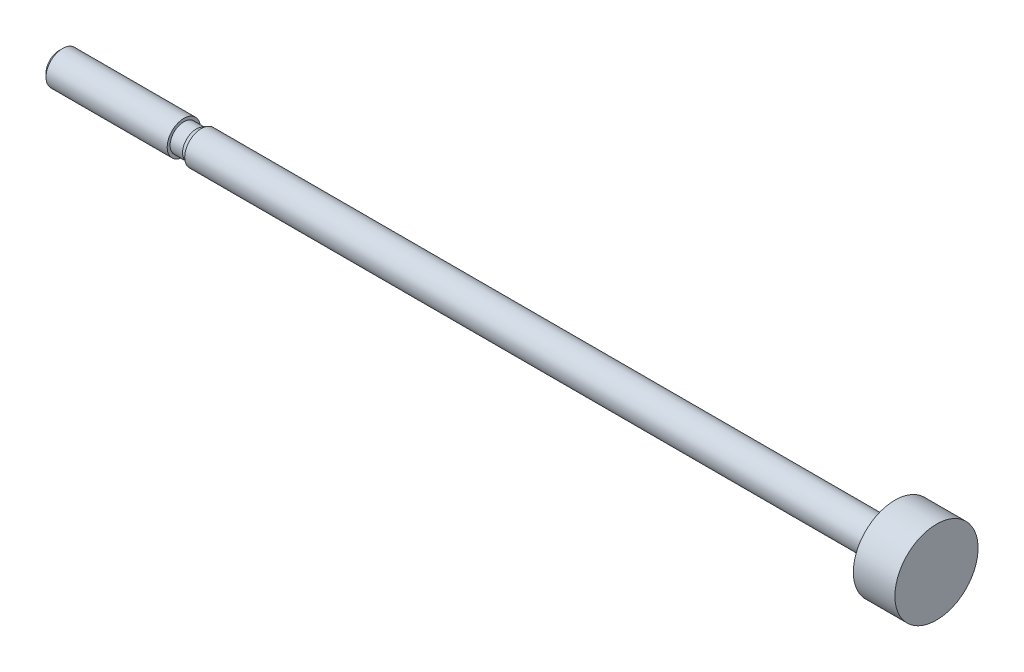
ISO-10303-21;
HEADER;
FILE_DESCRIPTION(('STEP AP214'),'2;1');
FILE_NAME('part.step','',(''),(''),'','','');
FILE_SCHEMA(('AUTOMOTIVE_DESIGN { 1 0 10303 214 1 1 1 1 }'));
ENDSEC;
DATA;
#1=APPLICATION_CONTEXT('core data for automotive mechanical design processes');
#2=APPLICATION_PROTOCOL_DEFINITION('international standard','automotive_design',2000,#1);
#3=PRODUCT_CONTEXT('',#1,'mechanical');
#4=PRODUCT('Part','Part','',(#3));
#5=PRODUCT_RELATED_PRODUCT_CATEGORY('part','',(#4));
#6=PRODUCT_DEFINITION_FORMATION('','',#4);
#7=PRODUCT_DEFINITION_CONTEXT('part definition',#1,'design');
#8=PRODUCT_DEFINITION('design','',#6,#7);
#9=PRODUCT_DEFINITION_SHAPE('','',#8);
#10=(LENGTH_UNIT() NAMED_UNIT(*) SI_UNIT(.MILLI.,.METRE.));
#11=(NAMED_UNIT(*) PLANE_ANGLE_UNIT() SI_UNIT($,.RADIAN.));
#12=(NAMED_UNIT(*) SI_UNIT($,.STERADIAN.) SOLID_ANGLE_UNIT());
#13=UNCERTAINTY_MEASURE_WITH_UNIT(LENGTH_MEASURE(1.E-05),#10,'distance_accuracy_value','');
#14=(GEOMETRIC_REPRESENTATION_CONTEXT(3) GLOBAL_UNCERTAINTY_ASSIGNED_CONTEXT((#13)) GLOBAL_UNIT_ASSIGNED_CONTEXT((#10,
#11,#12)) REPRESENTATION_CONTEXT('',''));
#15=CARTESIAN_POINT('',(0.,0.,0.));
#16=DIRECTION('',(0.,0.,1.));
#17=DIRECTION('',(1.,0.,0.));
#18=AXIS2_PLACEMENT_3D('',#15,#16,#17);
#19=CARTESIAN_POINT('',(0.,0.,0.));
#20=DIRECTION('',(1.,0.,0.));
#21=DIRECTION('',(0.,0.,-1.));
#22=AXIS2_PLACEMENT_3D('',#19,#20,#21);
#23=PLANE('',#22);
#24=CARTESIAN_POINT('',(0.,0.,0.));
#25=DIRECTION('',(-1.,0.,0.));
#26=DIRECTION('',(0.,0.,1.));
#27=AXIS2_PLACEMENT_3D('',#24,#25,#26);
#28=CIRCLE('',#27,1.5705);
#29=CARTESIAN_POINT('',(0.,0.,1.5705));
#30=VERTEX_POINT('',#29);
#31=EDGE_CURVE('E10',#30,#30,#28,.T.);
#32=ORIENTED_EDGE('',*,*,#31,.T.);
#33=EDGE_LOOP('',(#32));
#34=FACE_BOUND('',#33,.T.);
#35=ADVANCED_FACE('F34',(#34),#23,.F.);
#36=CARTESIAN_POINT('',(0.429499999999999,0.,0.));
#37=DIRECTION('',(1.,0.,0.));
#38=DIRECTION('',(0.,0.,-1.));
#39=AXIS2_PLACEMENT_3D('',#36,#37,#38);
#40=CONICAL_SURFACE('',#39,2.,0.785398163397449);
#41=ORIENTED_EDGE('',*,*,#31,.F.);
#42=EDGE_LOOP('',(#41));
#43=FACE_BOUND('',#42,.T.);
#44=CARTESIAN_POINT('',(0.429499999999999,0.,0.));
#45=DIRECTION('',(-1.,0.,0.));
#46=DIRECTION('',(0.,0.,1.));
#47=AXIS2_PLACEMENT_3D('',#44,#45,#46);
#48=CIRCLE('',#47,2.);
#49=CARTESIAN_POINT('',(0.429499999999999,0.,2.));
#50=VERTEX_POINT('',#49);
#51=EDGE_CURVE('E40',#50,#50,#48,.T.);
#52=ORIENTED_EDGE('',*,*,#51,.T.);
#53=EDGE_LOOP('',(#52));
#54=FACE_BOUND('',#53,.T.);
#55=ADVANCED_FACE('F81',(#43,#54),#40,.T.);
#56=CARTESIAN_POINT('',(105.5,0.,0.));
#57=DIRECTION('',(-1.,0.,0.));
#58=DIRECTION('',(0.,0.,1.));
#59=AXIS2_PLACEMENT_3D('',#56,#57,#58);
#60=CYLINDRICAL_SURFACE('',#59,2.);
#61=ORIENTED_EDGE('',*,*,#51,.F.);
#62=EDGE_LOOP('',(#61));
#63=FACE_BOUND('',#62,.T.);
#64=CARTESIAN_POINT('',(15.,0.,0.));
#65=DIRECTION('',(-1.,0.,0.));
#66=DIRECTION('',(0.,0.,1.));
#67=AXIS2_PLACEMENT_3D('',#64,#65,#66);
#68=CIRCLE('',#67,2.);
#69=CARTESIAN_POINT('',(15.,0.,2.));
#70=VERTEX_POINT('',#69);
#71=EDGE_CURVE('E44',#70,#70,#68,.T.);
#72=ORIENTED_EDGE('',*,*,#71,.T.);
#73=EDGE_LOOP('',(#72));
#74=FACE_BOUND('',#73,.T.);
#75=ADVANCED_FACE('F85',(#63,#74),#60,.T.);
#76=CARTESIAN_POINT('',(15.,2.,0.));
#77=DIRECTION('',(-1.,0.,0.));
#78=DIRECTION('',(0.,0.,1.));
#79=AXIS2_PLACEMENT_3D('',#76,#77,#78);
#80=PLANE('',#79);
#81=ORIENTED_EDGE('',*,*,#71,.F.);
#82=EDGE_LOOP('',(#81));
#83=FACE_BOUND('',#82,.T.);
#84=CARTESIAN_POINT('',(15.,0.,0.));
#85=DIRECTION('',(-1.,0.,0.));
#86=DIRECTION('',(0.,0.,1.));
#87=AXIS2_PLACEMENT_3D('',#84,#85,#86);
#88=CIRCLE('',#87,1.65);
#89=CARTESIAN_POINT('',(15.,0.,1.65));
#90=VERTEX_POINT('',#89);
#91=EDGE_CURVE('E48',#90,#90,#88,.T.);
#92=ORIENTED_EDGE('',*,*,#91,.T.);
#93=EDGE_LOOP('',(#92));
#94=FACE_BOUND('',#93,.T.);
#95=ADVANCED_FACE('F90',(#83,#94),#80,.F.);
#96=CARTESIAN_POINT('',(105.5,0.,0.));
#97=DIRECTION('',(-1.,0.,0.));
#98=DIRECTION('',(0.,0.,1.));
#99=AXIS2_PLACEMENT_3D('',#96,#97,#98);
#100=CYLINDRICAL_SURFACE('',#99,1.65);
#101=ORIENTED_EDGE('',*,*,#91,.F.);
#102=EDGE_LOOP('',(#101));
#103=FACE_BOUND('',#102,.T.);
#104=CARTESIAN_POINT('',(16.5,0.,0.));
#105=DIRECTION('',(-1.,0.,0.));
#106=DIRECTION('',(0.,0.,1.));
#107=AXIS2_PLACEMENT_3D('',#104,#105,#106);
#108=CIRCLE('',#107,1.65);
#109=CARTESIAN_POINT('',(16.5,0.,1.65));
#110=VERTEX_POINT('',#109);
#111=EDGE_CURVE('E53',#110,#110,#108,.T.);
#112=ORIENTED_EDGE('',*,*,#111,.T.);
#113=EDGE_LOOP('',(#112));
#114=FACE_BOUND('',#113,.T.);
#115=ADVANCED_FACE('F96',(#103,#114),#100,.T.);
#116=CARTESIAN_POINT('',(17.106217782649,0.,0.));
#117=DIRECTION('',(1.,0.,0.));
#118=DIRECTION('',(0.,0.,-1.));
#119=AXIS2_PLACEMENT_3D('',#116,#117,#118);
#120=CONICAL_SURFACE('',#119,2.,0.52359877559838);
#121=ORIENTED_EDGE('',*,*,#111,.F.);
#122=EDGE_LOOP('',(#121));
#123=FACE_BOUND('',#122,.T.);
#124=CARTESIAN_POINT('',(17.106217782649,0.,0.));
#125=DIRECTION('',(-1.,0.,0.));
#126=DIRECTION('',(0.,0.,1.));
#127=AXIS2_PLACEMENT_3D('',#124,#125,#126);
#128=CIRCLE('',#127,2.);
#129=CARTESIAN_POINT('',(17.106217782649,0.,2.));
#130=VERTEX_POINT('',#129);
#131=EDGE_CURVE('E56',#130,#130,#128,.T.);
#132=ORIENTED_EDGE('',*,*,#131,.T.);
#133=EDGE_LOOP('',(#132));
#134=FACE_BOUND('',#133,.T.);
#135=ADVANCED_FACE('F100',(#123,#134),#120,.T.);
#136=CARTESIAN_POINT('',(105.5,0.,0.));
#137=DIRECTION('',(-1.,0.,0.));
#138=DIRECTION('',(0.,0.,1.));
#139=AXIS2_PLACEMENT_3D('',#136,#137,#138);
#140=CYLINDRICAL_SURFACE('',#139,2.);
#141=ORIENTED_EDGE('',*,*,#131,.F.);
#142=EDGE_LOOP('',(#141));
#143=FACE_BOUND('',#142,.T.);
#144=CARTESIAN_POINT('',(100.5,0.,0.));
#145=DIRECTION('',(-1.,0.,0.));
#146=DIRECTION('',(0.,0.,1.));
#147=AXIS2_PLACEMENT_3D('',#144,#145,#146);
#148=CIRCLE('',#147,2.);
#149=CARTESIAN_POINT('',(100.5,0.,2.));
#150=VERTEX_POINT('',#149);
#151=EDGE_CURVE('E59',#150,#150,#148,.T.);
#152=ORIENTED_EDGE('',*,*,#151,.T.);
#153=EDGE_LOOP('',(#152));
#154=FACE_BOUND('',#153,.T.);
#155=ADVANCED_FACE('F104',(#143,#154),#140,.T.);
#156=CARTESIAN_POINT('',(100.5,2.,0.));
#157=DIRECTION('',(1.,0.,0.));
#158=DIRECTION('',(0.,0.,-1.));
#159=AXIS2_PLACEMENT_3D('',#156,#157,#158);
#160=PLANE('',#159);
#161=ORIENTED_EDGE('',*,*,#151,.F.);
#162=EDGE_LOOP('',(#161));
#163=FACE_BOUND('',#162,.T.);
#164=CARTESIAN_POINT('',(100.5,0.,0.));
#165=DIRECTION('',(-1.,0.,0.));
#166=DIRECTION('',(0.,0.,1.));
#167=AXIS2_PLACEMENT_3D('',#164,#165,#166);
#168=CIRCLE('',#167,5.);
#169=CARTESIAN_POINT('',(100.5,0.,5.));
#170=VERTEX_POINT('',#169);
#171=EDGE_CURVE('E62',#170,#170,#168,.T.);
#172=ORIENTED_EDGE('',*,*,#171,.T.);
#173=EDGE_LOOP('',(#172));
#174=FACE_BOUND('',#173,.T.);
#175=ADVANCED_FACE('F77',(#163,#174),#160,.F.);
#176=CARTESIAN_POINT('',(105.5,0.,0.));
#177=DIRECTION('',(-1.,0.,0.));
#178=DIRECTION('',(0.,0.,1.));
#179=AXIS2_PLACEMENT_3D('',#176,#177,#178);
#180=CYLINDRICAL_SURFACE('',#179,5.);
#181=ORIENTED_EDGE('',*,*,#171,.F.);
#182=EDGE_LOOP('',(#181));
#183=FACE_BOUND('',#182,.T.);
#184=CARTESIAN_POINT('',(105.5,0.,0.));
#185=DIRECTION('',(-1.,0.,0.));
#186=DIRECTION('',(0.,0.,1.));
#187=AXIS2_PLACEMENT_3D('',#184,#185,#186);
#188=CIRCLE('',#187,5.);
#189=CARTESIAN_POINT('',(105.5,0.,5.));
#190=VERTEX_POINT('',#189);
#191=EDGE_CURVE('E65',#190,#190,#188,.T.);
#192=ORIENTED_EDGE('',*,*,#191,.T.);
#193=EDGE_LOOP('',(#192));
#194=FACE_BOUND('',#193,.T.);
#195=ADVANCED_FACE('F69',(#183,#194),#180,.T.);
#196=CARTESIAN_POINT('',(105.5,5.,0.));
#197=DIRECTION('',(-1.,0.,0.));
#198=DIRECTION('',(0.,0.,1.));
#199=AXIS2_PLACEMENT_3D('',#196,#197,#198);
#200=PLANE('',#199);
#201=ORIENTED_EDGE('',*,*,#191,.F.);
#202=EDGE_LOOP('',(#201));
#203=FACE_BOUND('',#202,.T.);
#204=ADVANCED_FACE('F71',(#203),#200,.F.);
#205=CLOSED_SHELL('',(#35,#55,#75,#95,#115,#135,#155,#175,#195,#204));
#206=MANIFOLD_SOLID_BREP('B2',#205);
#207=ADVANCED_BREP_SHAPE_REPRESENTATION('',(#18,#206),#14);
#208=SHAPE_DEFINITION_REPRESENTATION(#9,#207);
ENDSEC;
END-ISO-10303-21;
